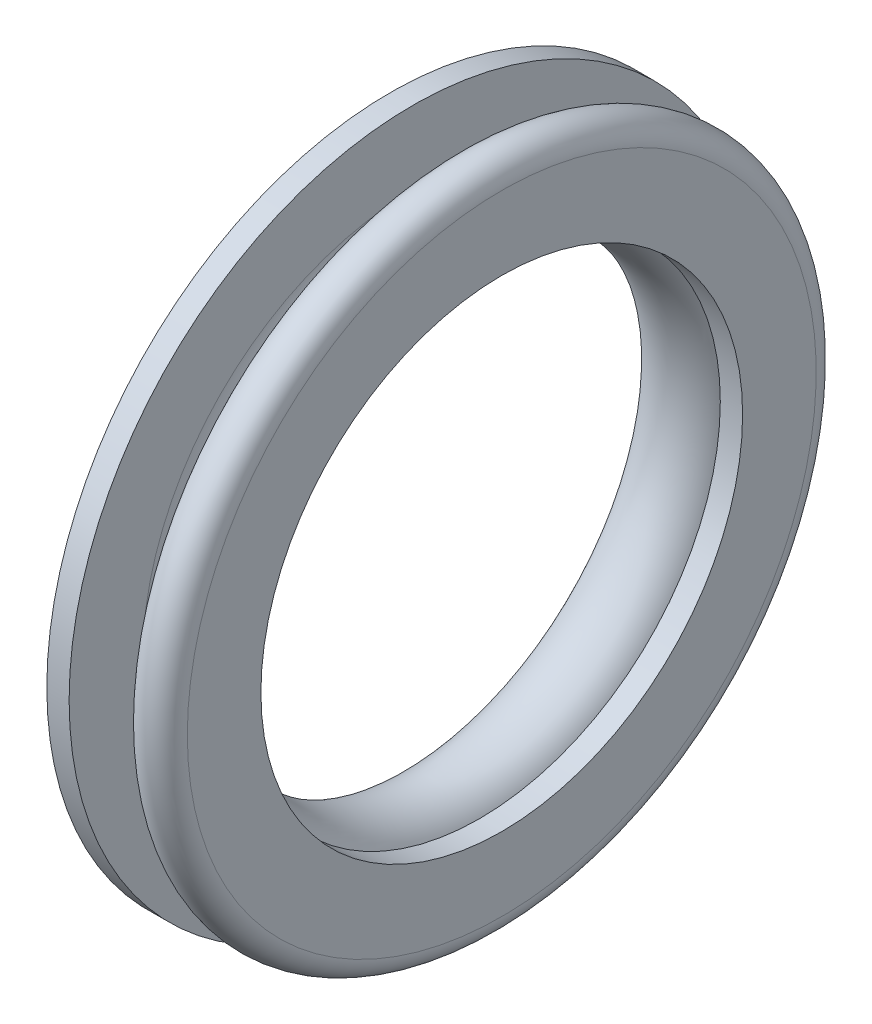
ISO-10303-21;
HEADER;
FILE_DESCRIPTION(('STEP AP214'),'2;1');
FILE_NAME('part.step','',(''),(''),'','','');
FILE_SCHEMA(('AUTOMOTIVE_DESIGN { 1 0 10303 214 1 1 1 1 }'));
ENDSEC;
DATA;
#1=APPLICATION_CONTEXT('core data for automotive mechanical design processes');
#2=APPLICATION_PROTOCOL_DEFINITION('international standard','automotive_design',2000,#1);
#3=PRODUCT_CONTEXT('',#1,'mechanical');
#4=PRODUCT('Part','Part','',(#3));
#5=PRODUCT_RELATED_PRODUCT_CATEGORY('part','',(#4));
#6=PRODUCT_DEFINITION_FORMATION('','',#4);
#7=PRODUCT_DEFINITION_CONTEXT('part definition',#1,'design');
#8=PRODUCT_DEFINITION('design','',#6,#7);
#9=PRODUCT_DEFINITION_SHAPE('','',#8);
#10=(LENGTH_UNIT() NAMED_UNIT(*) SI_UNIT(.MILLI.,.METRE.));
#11=(NAMED_UNIT(*) PLANE_ANGLE_UNIT() SI_UNIT($,.RADIAN.));
#12=(NAMED_UNIT(*) SI_UNIT($,.STERADIAN.) SOLID_ANGLE_UNIT());
#13=UNCERTAINTY_MEASURE_WITH_UNIT(LENGTH_MEASURE(1.E-05),#10,'distance_accuracy_value','');
#14=(GEOMETRIC_REPRESENTATION_CONTEXT(3) GLOBAL_UNCERTAINTY_ASSIGNED_CONTEXT((#13)) GLOBAL_UNIT_ASSIGNED_CONTEXT((#10,
#11,#12)) REPRESENTATION_CONTEXT('',''));
#15=CARTESIAN_POINT('',(0.,0.,0.));
#16=DIRECTION('',(0.,0.,1.));
#17=DIRECTION('',(1.,0.,0.));
#18=AXIS2_PLACEMENT_3D('',#15,#16,#17);
#19=CARTESIAN_POINT('',(0.,0.,0.));
#20=DIRECTION('',(-1.,0.,0.));
#21=DIRECTION('',(0.,0.,1.));
#22=AXIS2_PLACEMENT_3D('',#19,#20,#21);
#23=CYLINDRICAL_SURFACE('',#22,7.7);
#24=CARTESIAN_POINT('',(0.,0.,0.));
#25=DIRECTION('',(-1.,0.,0.));
#26=DIRECTION('',(0.,0.,1.));
#27=AXIS2_PLACEMENT_3D('',#24,#25,#26);
#28=CIRCLE('',#27,7.7);
#29=CARTESIAN_POINT('',(0.,0.,7.7));
#30=VERTEX_POINT('',#29);
#31=EDGE_CURVE('E10',#30,#30,#28,.T.);
#32=ORIENTED_EDGE('',*,*,#31,.F.);
#33=EDGE_LOOP('',(#32));
#34=FACE_BOUND('',#33,.T.);
#35=CARTESIAN_POINT('',(0.5,0.,0.));
#36=DIRECTION('',(-1.,0.,0.));
#37=DIRECTION('',(0.,0.,1.));
#38=AXIS2_PLACEMENT_3D('',#35,#36,#37);
#39=CIRCLE('',#38,7.7);
#40=CARTESIAN_POINT('',(0.5,0.,7.7));
#41=VERTEX_POINT('',#40);
#42=EDGE_CURVE('E64',#41,#41,#39,.T.);
#43=ORIENTED_EDGE('',*,*,#42,.T.);
#44=EDGE_LOOP('',(#43));
#45=FACE_BOUND('',#44,.T.);
#46=ADVANCED_FACE('F30',(#34,#45),#23,.T.);
#47=CARTESIAN_POINT('',(0.,7.7,0.));
#48=DIRECTION('',(1.,0.,0.));
#49=DIRECTION('',(0.,0.,-1.));
#50=AXIS2_PLACEMENT_3D('',#47,#48,#49);
#51=PLANE('',#50);
#52=CARTESIAN_POINT('',(0.,0.,0.));
#53=DIRECTION('',(-1.,0.,0.));
#54=DIRECTION('',(0.,0.,1.));
#55=AXIS2_PLACEMENT_3D('',#52,#53,#54);
#56=CIRCLE('',#55,6.05);
#57=CARTESIAN_POINT('',(0.,0.,6.05));
#58=VERTEX_POINT('',#57);
#59=EDGE_CURVE('E36',#58,#58,#56,.T.);
#60=ORIENTED_EDGE('',*,*,#59,.F.);
#61=EDGE_LOOP('',(#60));
#62=FACE_BOUND('',#61,.T.);
#63=ORIENTED_EDGE('',*,*,#31,.T.);
#64=EDGE_LOOP('',(#63));
#65=FACE_BOUND('',#64,.T.);
#66=ADVANCED_FACE('F113',(#62,#65),#51,.F.);
#67=CARTESIAN_POINT('',(1.,0.,0.));
#68=DIRECTION('',(-1.,0.,0.));
#69=DIRECTION('',(0.,0.,1.));
#70=AXIS2_PLACEMENT_3D('',#67,#68,#69);
#71=TOROIDAL_SURFACE('',#70,6.05,1.);
#72=CARTESIAN_POINT('',(2.,0.,0.));
#73=DIRECTION('',(-1.,0.,0.));
#74=DIRECTION('',(0.,0.,1.));
#75=AXIS2_PLACEMENT_3D('',#72,#73,#74);
#76=CIRCLE('',#75,6.05);
#77=CARTESIAN_POINT('',(2.,0.,6.05));
#78=VERTEX_POINT('',#77);
#79=EDGE_CURVE('E40',#78,#78,#76,.T.);
#80=ORIENTED_EDGE('',*,*,#79,.F.);
#81=EDGE_LOOP('',(#80));
#82=FACE_BOUND('',#81,.T.);
#83=ORIENTED_EDGE('',*,*,#59,.T.);
#84=EDGE_LOOP('',(#83));
#85=FACE_BOUND('',#84,.T.);
#86=ADVANCED_FACE('F108',(#82,#85),#71,.T.);
#87=CARTESIAN_POINT('',(2.,6.05,0.));
#88=DIRECTION('',(1.,0.,0.));
#89=DIRECTION('',(0.,0.,-1.));
#90=AXIS2_PLACEMENT_3D('',#87,#88,#89);
#91=PLANE('',#90);
#92=CARTESIAN_POINT('',(2.,0.,0.));
#93=DIRECTION('',(-1.,0.,0.));
#94=DIRECTION('',(0.,0.,1.));
#95=AXIS2_PLACEMENT_3D('',#92,#93,#94);
#96=CIRCLE('',#95,5.4);
#97=CARTESIAN_POINT('',(2.,0.,5.4));
#98=VERTEX_POINT('',#97);
#99=EDGE_CURVE('E44',#98,#98,#96,.T.);
#100=ORIENTED_EDGE('',*,*,#99,.F.);
#101=EDGE_LOOP('',(#100));
#102=FACE_BOUND('',#101,.T.);
#103=ORIENTED_EDGE('',*,*,#79,.T.);
#104=EDGE_LOOP('',(#103));
#105=FACE_BOUND('',#104,.T.);
#106=ADVANCED_FACE('F102',(#102,#105),#91,.F.);
#107=CARTESIAN_POINT('',(0.,0.,0.));
#108=DIRECTION('',(-1.,0.,0.));
#109=DIRECTION('',(0.,0.,1.));
#110=AXIS2_PLACEMENT_3D('',#107,#108,#109);
#111=CYLINDRICAL_SURFACE('',#110,5.4);
#112=CARTESIAN_POINT('',(2.5,0.,0.));
#113=DIRECTION('',(-1.,0.,0.));
#114=DIRECTION('',(0.,0.,1.));
#115=AXIS2_PLACEMENT_3D('',#112,#113,#114);
#116=CIRCLE('',#115,5.4);
#117=CARTESIAN_POINT('',(2.5,0.,5.4));
#118=VERTEX_POINT('',#117);
#119=EDGE_CURVE('E49',#118,#118,#116,.T.);
#120=ORIENTED_EDGE('',*,*,#119,.F.);
#121=EDGE_LOOP('',(#120));
#122=FACE_BOUND('',#121,.T.);
#123=ORIENTED_EDGE('',*,*,#99,.T.);
#124=EDGE_LOOP('',(#123));
#125=FACE_BOUND('',#124,.T.);
#126=ADVANCED_FACE('F96',(#122,#125),#111,.F.);
#127=CARTESIAN_POINT('',(2.5,7.05,0.));
#128=DIRECTION('',(-1.,0.,0.));
#129=DIRECTION('',(0.,0.,1.));
#130=AXIS2_PLACEMENT_3D('',#127,#128,#129);
#131=PLANE('',#130);
#132=CARTESIAN_POINT('',(2.5,0.,0.));
#133=DIRECTION('',(-1.,0.,0.));
#134=DIRECTION('',(0.,0.,1.));
#135=AXIS2_PLACEMENT_3D('',#132,#133,#134);
#136=CIRCLE('',#135,7.05);
#137=CARTESIAN_POINT('',(2.5,0.,7.05));
#138=VERTEX_POINT('',#137);
#139=EDGE_CURVE('E52',#138,#138,#136,.T.);
#140=ORIENTED_EDGE('',*,*,#139,.F.);
#141=EDGE_LOOP('',(#140));
#142=FACE_BOUND('',#141,.T.);
#143=ORIENTED_EDGE('',*,*,#119,.T.);
#144=EDGE_LOOP('',(#143));
#145=FACE_BOUND('',#144,.T.);
#146=ADVANCED_FACE('F90',(#142,#145),#131,.F.);
#147=CARTESIAN_POINT('',(2.,0.,0.));
#148=DIRECTION('',(-1.,0.,0.));
#149=DIRECTION('',(0.,0.,1.));
#150=AXIS2_PLACEMENT_3D('',#147,#148,#149);
#151=TOROIDAL_SURFACE('',#150,7.05,0.499999999999999);
#152=CARTESIAN_POINT('',(1.5,0.,0.));
#153=DIRECTION('',(-1.,0.,0.));
#154=DIRECTION('',(0.,0.,1.));
#155=AXIS2_PLACEMENT_3D('',#152,#153,#154);
#156=CIRCLE('',#155,7.05);
#157=CARTESIAN_POINT('',(1.5,0.,7.05));
#158=VERTEX_POINT('',#157);
#159=EDGE_CURVE('E55',#158,#158,#156,.T.);
#160=ORIENTED_EDGE('',*,*,#159,.F.);
#161=EDGE_LOOP('',(#160));
#162=FACE_BOUND('',#161,.T.);
#163=ORIENTED_EDGE('',*,*,#139,.T.);
#164=EDGE_LOOP('',(#163));
#165=FACE_BOUND('',#164,.T.);
#166=ADVANCED_FACE('F84',(#162,#165),#151,.T.);
#167=CARTESIAN_POINT('',(1.5,6.05,0.));
#168=DIRECTION('',(1.,0.,0.));
#169=DIRECTION('',(0.,0.,-1.));
#170=AXIS2_PLACEMENT_3D('',#167,#168,#169);
#171=PLANE('',#170);
#172=CARTESIAN_POINT('',(1.5,0.,0.));
#173=DIRECTION('',(-1.,0.,0.));
#174=DIRECTION('',(0.,0.,1.));
#175=AXIS2_PLACEMENT_3D('',#172,#173,#174);
#176=CIRCLE('',#175,6.05);
#177=CARTESIAN_POINT('',(1.5,0.,6.05));
#178=VERTEX_POINT('',#177);
#179=EDGE_CURVE('E58',#178,#178,#176,.T.);
#180=ORIENTED_EDGE('',*,*,#179,.F.);
#181=EDGE_LOOP('',(#180));
#182=FACE_BOUND('',#181,.T.);
#183=ORIENTED_EDGE('',*,*,#159,.T.);
#184=EDGE_LOOP('',(#183));
#185=FACE_BOUND('',#184,.T.);
#186=ADVANCED_FACE('F78',(#182,#185),#171,.F.);
#187=CARTESIAN_POINT('',(1.,0.,0.));
#188=DIRECTION('',(-1.,0.,0.));
#189=DIRECTION('',(0.,0.,1.));
#190=AXIS2_PLACEMENT_3D('',#187,#188,#189);
#191=TOROIDAL_SURFACE('',#190,6.05,0.5);
#192=CARTESIAN_POINT('',(0.5,0.,0.));
#193=DIRECTION('',(-1.,0.,0.));
#194=DIRECTION('',(0.,0.,1.));
#195=AXIS2_PLACEMENT_3D('',#192,#193,#194);
#196=CIRCLE('',#195,6.05);
#197=CARTESIAN_POINT('',(0.5,0.,6.05));
#198=VERTEX_POINT('',#197);
#199=EDGE_CURVE('E61',#198,#198,#196,.T.);
#200=ORIENTED_EDGE('',*,*,#199,.F.);
#201=EDGE_LOOP('',(#200));
#202=FACE_BOUND('',#201,.T.);
#203=ORIENTED_EDGE('',*,*,#179,.T.);
#204=EDGE_LOOP('',(#203));
#205=FACE_BOUND('',#204,.T.);
#206=ADVANCED_FACE('F72',(#202,#205),#191,.F.);
#207=CARTESIAN_POINT('',(0.5,7.7,0.));
#208=DIRECTION('',(-1.,0.,0.));
#209=DIRECTION('',(0.,0.,1.));
#210=AXIS2_PLACEMENT_3D('',#207,#208,#209);
#211=PLANE('',#210);
#212=ORIENTED_EDGE('',*,*,#42,.F.);
#213=EDGE_LOOP('',(#212));
#214=FACE_BOUND('',#213,.T.);
#215=ORIENTED_EDGE('',*,*,#199,.T.);
#216=EDGE_LOOP('',(#215));
#217=FACE_BOUND('',#216,.T.);
#218=ADVANCED_FACE('F69',(#214,#217),#211,.F.);
#219=CLOSED_SHELL('',(#46,#66,#86,#106,#126,#146,#166,#186,#206,#218));
#220=MANIFOLD_SOLID_BREP('B2',#219);
#221=ADVANCED_BREP_SHAPE_REPRESENTATION('',(#18,#220),#14);
#222=SHAPE_DEFINITION_REPRESENTATION(#9,#221);
ENDSEC;
END-ISO-10303-21;
